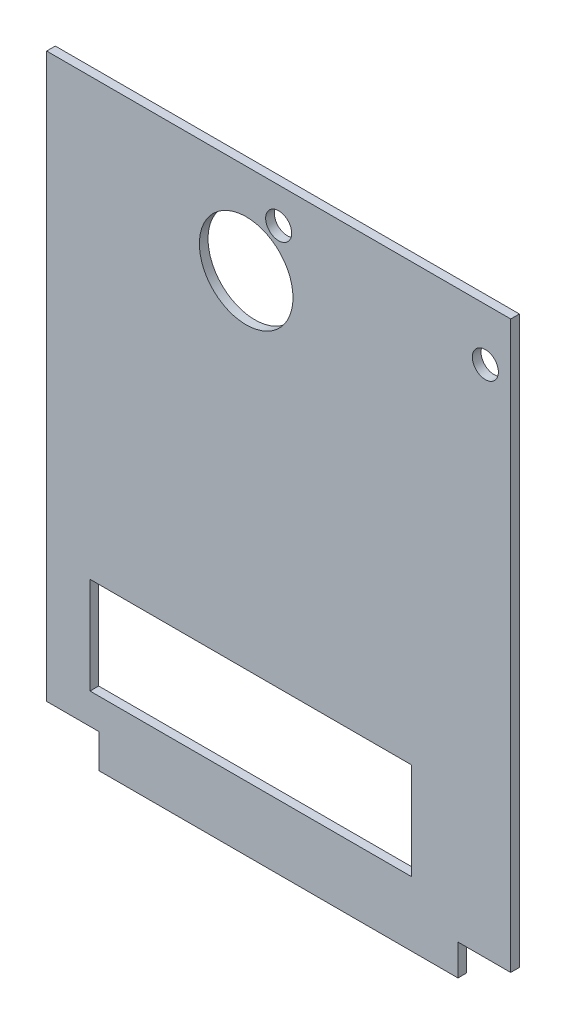
ISO-10303-21;
HEADER;
FILE_DESCRIPTION(('STEP AP214'),'2;1');
FILE_NAME('part.step','',(''),(''),'','','');
FILE_SCHEMA(('AUTOMOTIVE_DESIGN { 1 0 10303 214 1 1 1 1 }'));
ENDSEC;
DATA;
#1=APPLICATION_CONTEXT('core data for automotive mechanical design processes');
#2=APPLICATION_PROTOCOL_DEFINITION('international standard','automotive_design',2000,#1);
#3=PRODUCT_CONTEXT('',#1,'mechanical');
#4=PRODUCT('Part','Part','',(#3));
#5=PRODUCT_RELATED_PRODUCT_CATEGORY('part','',(#4));
#6=PRODUCT_DEFINITION_FORMATION('','',#4);
#7=PRODUCT_DEFINITION_CONTEXT('part definition',#1,'design');
#8=PRODUCT_DEFINITION('design','',#6,#7);
#9=PRODUCT_DEFINITION_SHAPE('','',#8);
#10=(LENGTH_UNIT() NAMED_UNIT(*) SI_UNIT(.MILLI.,.METRE.));
#11=(NAMED_UNIT(*) PLANE_ANGLE_UNIT() SI_UNIT($,.RADIAN.));
#12=(NAMED_UNIT(*) SI_UNIT($,.STERADIAN.) SOLID_ANGLE_UNIT());
#13=UNCERTAINTY_MEASURE_WITH_UNIT(LENGTH_MEASURE(1.E-05),#10,'distance_accuracy_value','');
#14=(GEOMETRIC_REPRESENTATION_CONTEXT(3) GLOBAL_UNCERTAINTY_ASSIGNED_CONTEXT((#13)) GLOBAL_UNIT_ASSIGNED_CONTEXT((#10,
#11,#12)) REPRESENTATION_CONTEXT('',''));
#15=CARTESIAN_POINT('',(0.,0.,0.));
#16=DIRECTION('',(0.,0.,1.));
#17=DIRECTION('',(1.,0.,0.));
#18=AXIS2_PLACEMENT_3D('',#15,#16,#17);
#19=CARTESIAN_POINT('',(-42.8139737991267,46.3633187772926,1.524));
#20=DIRECTION('',(1.,0.,0.));
#21=DIRECTION('',(0.,1.,0.));
#22=AXIS2_PLACEMENT_3D('',#19,#20,#21);
#23=PLANE('',#22);
#24=DIRECTION('',(0.,-1.,0.));
#25=VECTOR('',#24,1.);
#26=CARTESIAN_POINT('',(-42.8139737991267,46.3633187772926,0.));
#27=LINE('',#26,#25);
#28=CARTESIAN_POINT('',(-42.8139737991267,46.3633187772926,0.));
#29=VERTEX_POINT('',#28);
#30=CARTESIAN_POINT('',(-42.8139737991266,-52.5886812227074,0.));
#31=VERTEX_POINT('',#30);
#32=EDGE_CURVE('E197',#29,#31,#27,.T.);
#33=ORIENTED_EDGE('',*,*,#32,.T.);
#34=DIRECTION('',(0.,0.,1.));
#35=VECTOR('',#34,1.);
#36=CARTESIAN_POINT('',(-42.8139737991266,-52.5886812227074,0.));
#37=LINE('',#36,#35);
#38=CARTESIAN_POINT('',(-42.8139737991266,-52.5886812227074,1.524));
#39=VERTEX_POINT('',#38);
#40=EDGE_CURVE('E194',#31,#39,#37,.T.);
#41=ORIENTED_EDGE('',*,*,#40,.T.);
#42=DIRECTION('',(0.,-1.,0.));
#43=VECTOR('',#42,1.);
#44=CARTESIAN_POINT('',(-42.8139737991267,46.3633187772926,1.524));
#45=LINE('',#44,#43);
#46=CARTESIAN_POINT('',(-42.8139737991267,46.3633187772926,1.524));
#47=VERTEX_POINT('',#46);
#48=EDGE_CURVE('E201',#47,#39,#45,.T.);
#49=ORIENTED_EDGE('',*,*,#48,.F.);
#50=DIRECTION('',(0.,0.,-1.));
#51=VECTOR('',#50,1.);
#52=CARTESIAN_POINT('',(-42.8139737991267,46.3633187772926,1.524));
#53=LINE('',#52,#51);
#54=EDGE_CURVE('E43',#47,#29,#53,.T.);
#55=ORIENTED_EDGE('',*,*,#54,.T.);
#56=EDGE_LOOP('',(#33,#41,#49,#55));
#57=FACE_BOUND('',#56,.T.);
#58=ADVANCED_FACE('F35',(#57),#23,.F.);
#59=CARTESIAN_POINT('',(-42.8139737991266,-58.5386812227074,1.524));
#60=DIRECTION('',(0.,1.,0.));
#61=DIRECTION('',(0.,0.,1.));
#62=AXIS2_PLACEMENT_3D('',#59,#60,#61);
#63=PLANE('',#62);
#64=DIRECTION('',(1.,0.,0.));
#65=VECTOR('',#64,1.);
#66=CARTESIAN_POINT('',(-42.8139737991266,-58.5386812227074,0.));
#67=LINE('',#66,#65);
#68=CARTESIAN_POINT('',(-33.6439737991266,-58.5386812227074,0.));
#69=VERTEX_POINT('',#68);
#70=CARTESIAN_POINT('',(29.4539364337291,-58.5386812227074,0.));
#71=VERTEX_POINT('',#70);
#72=EDGE_CURVE('E214',#69,#71,#67,.T.);
#73=ORIENTED_EDGE('',*,*,#72,.T.);
#74=DIRECTION('',(0.,0.,1.));
#75=VECTOR('',#74,1.);
#76=CARTESIAN_POINT('',(29.4539364337291,-58.5386812227074,0.));
#77=LINE('',#76,#75);
#78=CARTESIAN_POINT('',(29.4539364337291,-58.5386812227074,1.524));
#79=VERTEX_POINT('',#78);
#80=EDGE_CURVE('E176',#71,#79,#77,.T.);
#81=ORIENTED_EDGE('',*,*,#80,.T.);
#82=DIRECTION('',(1.,0.,0.));
#83=VECTOR('',#82,1.);
#84=CARTESIAN_POINT('',(-42.8139737991266,-58.5386812227074,1.524));
#85=LINE('',#84,#83);
#86=CARTESIAN_POINT('',(-33.6439737991266,-58.5386812227074,1.524));
#87=VERTEX_POINT('',#86);
#88=EDGE_CURVE('E204',#87,#79,#85,.T.);
#89=ORIENTED_EDGE('',*,*,#88,.F.);
#90=DIRECTION('',(0.,0.,1.));
#91=VECTOR('',#90,1.);
#92=CARTESIAN_POINT('',(-33.6439737991266,-58.5386812227074,0.));
#93=LINE('',#92,#91);
#94=EDGE_CURVE('E190',#69,#87,#93,.T.);
#95=ORIENTED_EDGE('',*,*,#94,.F.);
#96=EDGE_LOOP('',(#73,#81,#89,#95));
#97=FACE_BOUND('',#96,.T.);
#98=ADVANCED_FACE('F255',(#97),#63,.F.);
#99=CARTESIAN_POINT('',(38.7200262008733,46.3633187772926,1.524));
#100=DIRECTION('',(-1.,0.,0.));
#101=DIRECTION('',(0.,-1.,0.));
#102=AXIS2_PLACEMENT_3D('',#99,#100,#101);
#103=PLANE('',#102);
#104=DIRECTION('',(0.,1.,0.));
#105=VECTOR('',#104,1.);
#106=CARTESIAN_POINT('',(38.7200262008733,46.3633187772926,1.524));
#107=LINE('',#106,#105);
#108=CARTESIAN_POINT('',(38.7200262008734,-53.0666812227074,1.524));
#109=VERTEX_POINT('',#108);
#110=CARTESIAN_POINT('',(38.7200262008733,46.3633187772926,1.524));
#111=VERTEX_POINT('',#110);
#112=EDGE_CURVE('E208',#109,#111,#107,.T.);
#113=ORIENTED_EDGE('',*,*,#112,.F.);
#114=DIRECTION('',(0.,0.,1.));
#115=VECTOR('',#114,1.);
#116=CARTESIAN_POINT('',(38.7200262008734,-53.0666812227074,0.));
#117=LINE('',#116,#115);
#118=CARTESIAN_POINT('',(38.7200262008734,-53.0666812227074,0.));
#119=VERTEX_POINT('',#118);
#120=EDGE_CURVE('E172',#119,#109,#117,.T.);
#121=ORIENTED_EDGE('',*,*,#120,.F.);
#122=DIRECTION('',(0.,1.,0.));
#123=VECTOR('',#122,1.);
#124=CARTESIAN_POINT('',(38.7200262008733,46.3633187772926,0.));
#125=LINE('',#124,#123);
#126=CARTESIAN_POINT('',(38.7200262008733,46.3633187772926,0.));
#127=VERTEX_POINT('',#126);
#128=EDGE_CURVE('E217',#119,#127,#125,.T.);
#129=ORIENTED_EDGE('',*,*,#128,.T.);
#130=DIRECTION('',(0.,0.,-1.));
#131=VECTOR('',#130,1.);
#132=CARTESIAN_POINT('',(38.7200262008733,46.3633187772926,1.524));
#133=LINE('',#132,#131);
#134=EDGE_CURVE('E11',#111,#127,#133,.T.);
#135=ORIENTED_EDGE('',*,*,#134,.F.);
#136=EDGE_LOOP('',(#113,#121,#129,#135));
#137=FACE_BOUND('',#136,.T.);
#138=ADVANCED_FACE('F247',(#137),#103,.F.);
#139=CARTESIAN_POINT('',(-42.8139737991267,46.3633187772926,1.524));
#140=DIRECTION('',(0.,-1.,0.));
#141=DIRECTION('',(0.,0.,-1.));
#142=AXIS2_PLACEMENT_3D('',#139,#140,#141);
#143=PLANE('',#142);
#144=DIRECTION('',(-1.,0.,0.));
#145=VECTOR('',#144,1.);
#146=CARTESIAN_POINT('',(-42.8139737991267,46.3633187772926,0.));
#147=LINE('',#146,#145);
#148=EDGE_CURVE('E205',#127,#29,#147,.T.);
#149=ORIENTED_EDGE('',*,*,#148,.T.);
#150=ORIENTED_EDGE('',*,*,#54,.F.);
#151=DIRECTION('',(-1.,0.,0.));
#152=VECTOR('',#151,1.);
#153=CARTESIAN_POINT('',(-42.8139737991267,46.3633187772926,1.524));
#154=LINE('',#153,#152);
#155=EDGE_CURVE('E210',#111,#47,#154,.T.);
#156=ORIENTED_EDGE('',*,*,#155,.F.);
#157=ORIENTED_EDGE('',*,*,#134,.T.);
#158=EDGE_LOOP('',(#149,#150,#156,#157));
#159=FACE_BOUND('',#158,.T.);
#160=ADVANCED_FACE('F245',(#159),#143,.F.);
#161=CARTESIAN_POINT('',(0.,0.,1.524));
#162=DIRECTION('',(0.,0.,1.));
#163=DIRECTION('',(1.,0.,0.));
#164=AXIS2_PLACEMENT_3D('',#161,#162,#163);
#165=PLANE('',#164);
#166=CARTESIAN_POINT('',(-7.75309894264389,30.4572449747181,1.524));
#167=DIRECTION('',(0.,0.,1.));
#168=DIRECTION('',(1.,0.,0.));
#169=AXIS2_PLACEMENT_3D('',#166,#167,#168);
#170=CIRCLE('',#169,8.22407723947342);
#171=CARTESIAN_POINT('',(0.470978296829531,30.4572449747181,1.524));
#172=VERTEX_POINT('',#171);
#173=EDGE_CURVE('E306',#172,#172,#170,.T.);
#174=ORIENTED_EDGE('',*,*,#173,.F.);
#175=EDGE_LOOP('',(#174));
#176=FACE_BOUND('',#175,.T.);
#177=CARTESIAN_POINT('',(34.2650262008734,37.1933187772926,1.524));
#178=DIRECTION('',(0.,0.,1.));
#179=DIRECTION('',(1.,0.,0.));
#180=AXIS2_PLACEMENT_3D('',#177,#178,#179);
#181=CIRCLE('',#180,2.285);
#182=CARTESIAN_POINT('',(36.5500262008734,37.1933187772926,1.524));
#183=VERTEX_POINT('',#182);
#184=EDGE_CURVE('E309',#183,#183,#181,.T.);
#185=ORIENTED_EDGE('',*,*,#184,.F.);
#186=EDGE_LOOP('',(#185));
#187=FACE_BOUND('',#186,.T.);
#188=CARTESIAN_POINT('',(-2.04697379912665,40.1583187772926,1.524));
#189=DIRECTION('',(0.,0.,1.));
#190=DIRECTION('',(1.,0.,0.));
#191=AXIS2_PLACEMENT_3D('',#188,#189,#190);
#192=CIRCLE('',#191,2.285);
#193=CARTESIAN_POINT('',(0.238026200873347,40.1583187772926,1.524));
#194=VERTEX_POINT('',#193);
#195=EDGE_CURVE('E148',#194,#194,#192,.T.);
#196=ORIENTED_EDGE('',*,*,#195,.F.);
#197=EDGE_LOOP('',(#196));
#198=FACE_BOUND('',#197,.T.);
#199=DIRECTION('',(0.,1.,0.));
#200=VECTOR('',#199,1.);
#201=CARTESIAN_POINT('',(21.3160262008734,-47.1986812227074,1.524));
#202=LINE('',#201,#200);
#203=CARTESIAN_POINT('',(21.3160262008734,-47.1986812227074,1.524));
#204=VERTEX_POINT('',#203);
#205=CARTESIAN_POINT('',(21.3160262008734,-30.1986812227074,1.524));
#206=VERTEX_POINT('',#205);
#207=EDGE_CURVE('E50',#204,#206,#202,.T.);
#208=ORIENTED_EDGE('',*,*,#207,.F.);
#209=DIRECTION('',(1.,0.,0.));
#210=VECTOR('',#209,1.);
#211=CARTESIAN_POINT('',(-35.1839737991266,-47.1986812227074,1.524));
#212=LINE('',#211,#210);
#213=CARTESIAN_POINT('',(-35.1839737991266,-47.1986812227074,1.524));
#214=VERTEX_POINT('',#213);
#215=EDGE_CURVE('E142',#214,#204,#212,.T.);
#216=ORIENTED_EDGE('',*,*,#215,.F.);
#217=DIRECTION('',(0.,-1.,0.));
#218=VECTOR('',#217,1.);
#219=CARTESIAN_POINT('',(-35.1839737991266,-47.1986812227074,1.524));
#220=LINE('',#219,#218);
#221=CARTESIAN_POINT('',(-35.1839737991266,-30.1986812227074,1.524));
#222=VERTEX_POINT('',#221);
#223=EDGE_CURVE('E145',#222,#214,#220,.T.);
#224=ORIENTED_EDGE('',*,*,#223,.F.);
#225=DIRECTION('',(-1.,0.,0.));
#226=VECTOR('',#225,1.);
#227=CARTESIAN_POINT('',(-35.1839737991266,-30.1986812227074,1.524));
#228=LINE('',#227,#226);
#229=EDGE_CURVE('E154',#206,#222,#228,.T.);
#230=ORIENTED_EDGE('',*,*,#229,.F.);
#231=EDGE_LOOP('',(#208,#216,#224,#230));
#232=FACE_BOUND('',#231,.T.);
#233=DIRECTION('',(0.,-1.,0.));
#234=VECTOR('',#233,1.);
#235=CARTESIAN_POINT('',(29.4539364337291,-58.5386812227074,1.524));
#236=LINE('',#235,#234);
#237=CARTESIAN_POINT('',(29.4539364337291,-53.0666812227074,1.524));
#238=VERTEX_POINT('',#237);
#239=EDGE_CURVE('E169',#238,#79,#236,.T.);
#240=ORIENTED_EDGE('',*,*,#239,.F.);
#241=DIRECTION('',(-1.,0.,0.));
#242=VECTOR('',#241,1.);
#243=CARTESIAN_POINT('',(38.7200262008734,-53.0666812227074,1.524));
#244=LINE('',#243,#242);
#245=EDGE_CURVE('E161',#109,#238,#244,.T.);
#246=ORIENTED_EDGE('',*,*,#245,.F.);
#247=ORIENTED_EDGE('',*,*,#112,.T.);
#248=ORIENTED_EDGE('',*,*,#155,.T.);
#249=ORIENTED_EDGE('',*,*,#48,.T.);
#250=DIRECTION('',(-1.,0.,0.));
#251=VECTOR('',#250,1.);
#252=CARTESIAN_POINT('',(-42.8139737991266,-52.5886812227074,1.524));
#253=LINE('',#252,#251);
#254=CARTESIAN_POINT('',(-33.6439737991266,-52.5886812227074,1.524));
#255=VERTEX_POINT('',#254);
#256=EDGE_CURVE('E187',#255,#39,#253,.T.);
#257=ORIENTED_EDGE('',*,*,#256,.F.);
#258=DIRECTION('',(0.,1.,0.));
#259=VECTOR('',#258,1.);
#260=CARTESIAN_POINT('',(-33.6439737991266,-58.5386812227074,1.524));
#261=LINE('',#260,#259);
#262=EDGE_CURVE('E179',#87,#255,#261,.T.);
#263=ORIENTED_EDGE('',*,*,#262,.F.);
#264=ORIENTED_EDGE('',*,*,#88,.T.);
#265=EDGE_LOOP('',(#240,#246,#247,#248,#249,#257,#263,#264));
#266=FACE_BOUND('',#265,.T.);
#267=ADVANCED_FACE('F241',(#176,#187,#198,#232,#266),#165,.T.);
#268=CARTESIAN_POINT('',(0.,0.,0.));
#269=DIRECTION('',(0.,0.,1.));
#270=DIRECTION('',(1.,0.,0.));
#271=AXIS2_PLACEMENT_3D('',#268,#269,#270);
#272=PLANE('',#271);
#273=CARTESIAN_POINT('',(-7.75309894264389,30.4572449747181,0.));
#274=DIRECTION('',(0.,0.,1.));
#275=DIRECTION('',(1.,0.,0.));
#276=AXIS2_PLACEMENT_3D('',#273,#274,#275);
#277=CIRCLE('',#276,8.22407723947342);
#278=CARTESIAN_POINT('',(0.470978296829531,30.4572449747181,0.));
#279=VERTEX_POINT('',#278);
#280=EDGE_CURVE('E38',#279,#279,#277,.T.);
#281=ORIENTED_EDGE('',*,*,#280,.T.);
#282=EDGE_LOOP('',(#281));
#283=FACE_BOUND('',#282,.T.);
#284=CARTESIAN_POINT('',(34.2650262008734,37.1933187772926,0.));
#285=DIRECTION('',(0.,0.,1.));
#286=DIRECTION('',(1.,0.,0.));
#287=AXIS2_PLACEMENT_3D('',#284,#285,#286);
#288=CIRCLE('',#287,2.285);
#289=CARTESIAN_POINT('',(36.5500262008734,37.1933187772926,0.));
#290=VERTEX_POINT('',#289);
#291=EDGE_CURVE('E311',#290,#290,#288,.T.);
#292=ORIENTED_EDGE('',*,*,#291,.T.);
#293=EDGE_LOOP('',(#292));
#294=FACE_BOUND('',#293,.T.);
#295=CARTESIAN_POINT('',(-2.04697379912665,40.1583187772926,0.));
#296=DIRECTION('',(0.,0.,1.));
#297=DIRECTION('',(1.,0.,0.));
#298=AXIS2_PLACEMENT_3D('',#295,#296,#297);
#299=CIRCLE('',#298,2.285);
#300=CARTESIAN_POINT('',(0.238026200873347,40.1583187772926,0.));
#301=VERTEX_POINT('',#300);
#302=EDGE_CURVE('E155',#301,#301,#299,.T.);
#303=ORIENTED_EDGE('',*,*,#302,.T.);
#304=EDGE_LOOP('',(#303));
#305=FACE_BOUND('',#304,.T.);
#306=DIRECTION('',(1.,0.,0.));
#307=VECTOR('',#306,1.);
#308=CARTESIAN_POINT('',(-35.1839737991266,-47.1986812227074,0.));
#309=LINE('',#308,#307);
#310=CARTESIAN_POINT('',(-35.1839737991266,-47.1986812227074,0.));
#311=VERTEX_POINT('',#310);
#312=CARTESIAN_POINT('',(21.3160262008734,-47.1986812227074,0.));
#313=VERTEX_POINT('',#312);
#314=EDGE_CURVE('E132',#311,#313,#309,.T.);
#315=ORIENTED_EDGE('',*,*,#314,.T.);
#316=DIRECTION('',(0.,1.,0.));
#317=VECTOR('',#316,1.);
#318=CARTESIAN_POINT('',(21.3160262008734,-47.1986812227074,0.));
#319=LINE('',#318,#317);
#320=CARTESIAN_POINT('',(21.3160262008734,-30.1986812227074,0.));
#321=VERTEX_POINT('',#320);
#322=EDGE_CURVE('E126',#313,#321,#319,.T.);
#323=ORIENTED_EDGE('',*,*,#322,.T.);
#324=DIRECTION('',(-1.,0.,0.));
#325=VECTOR('',#324,1.);
#326=CARTESIAN_POINT('',(-35.1839737991266,-30.1986812227074,0.));
#327=LINE('',#326,#325);
#328=CARTESIAN_POINT('',(-35.1839737991266,-30.1986812227074,0.));
#329=VERTEX_POINT('',#328);
#330=EDGE_CURVE('E135',#321,#329,#327,.T.);
#331=ORIENTED_EDGE('',*,*,#330,.T.);
#332=DIRECTION('',(0.,-1.,0.));
#333=VECTOR('',#332,1.);
#334=CARTESIAN_POINT('',(-35.1839737991266,-47.1986812227074,0.));
#335=LINE('',#334,#333);
#336=EDGE_CURVE('E58',#329,#311,#335,.T.);
#337=ORIENTED_EDGE('',*,*,#336,.T.);
#338=EDGE_LOOP('',(#315,#323,#331,#337));
#339=FACE_BOUND('',#338,.T.);
#340=DIRECTION('',(-1.,0.,0.));
#341=VECTOR('',#340,1.);
#342=CARTESIAN_POINT('',(38.7200262008734,-53.0666812227074,0.));
#343=LINE('',#342,#341);
#344=CARTESIAN_POINT('',(29.4539364337291,-53.0666812227074,0.));
#345=VERTEX_POINT('',#344);
#346=EDGE_CURVE('E165',#119,#345,#343,.T.);
#347=ORIENTED_EDGE('',*,*,#346,.T.);
#348=DIRECTION('',(0.,-1.,0.));
#349=VECTOR('',#348,1.);
#350=CARTESIAN_POINT('',(29.4539364337291,-58.5386812227074,0.));
#351=LINE('',#350,#349);
#352=EDGE_CURVE('E168',#345,#71,#351,.T.);
#353=ORIENTED_EDGE('',*,*,#352,.T.);
#354=ORIENTED_EDGE('',*,*,#72,.F.);
#355=DIRECTION('',(0.,1.,0.));
#356=VECTOR('',#355,1.);
#357=CARTESIAN_POINT('',(-33.6439737991266,-58.5386812227074,0.));
#358=LINE('',#357,#356);
#359=CARTESIAN_POINT('',(-33.6439737991266,-52.5886812227074,0.));
#360=VERTEX_POINT('',#359);
#361=EDGE_CURVE('E183',#69,#360,#358,.T.);
#362=ORIENTED_EDGE('',*,*,#361,.T.);
#363=DIRECTION('',(-1.,0.,0.));
#364=VECTOR('',#363,1.);
#365=CARTESIAN_POINT('',(-42.8139737991266,-52.5886812227074,0.));
#366=LINE('',#365,#364);
#367=EDGE_CURVE('E186',#360,#31,#366,.T.);
#368=ORIENTED_EDGE('',*,*,#367,.T.);
#369=ORIENTED_EDGE('',*,*,#32,.F.);
#370=ORIENTED_EDGE('',*,*,#148,.F.);
#371=ORIENTED_EDGE('',*,*,#128,.F.);
#372=EDGE_LOOP('',(#347,#353,#354,#362,#368,#369,#370,#371));
#373=FACE_BOUND('',#372,.T.);
#374=ADVANCED_FACE('F139',(#283,#294,#305,#339,#373),#272,.F.);
#375=CARTESIAN_POINT('',(-42.8139737991266,-52.5886812227074,0.));
#376=DIRECTION('',(0.,1.,0.));
#377=DIRECTION('',(0.,0.,1.));
#378=AXIS2_PLACEMENT_3D('',#375,#376,#377);
#379=PLANE('',#378);
#380=ORIENTED_EDGE('',*,*,#256,.T.);
#381=ORIENTED_EDGE('',*,*,#40,.F.);
#382=ORIENTED_EDGE('',*,*,#367,.F.);
#383=DIRECTION('',(0.,0.,1.));
#384=VECTOR('',#383,1.);
#385=CARTESIAN_POINT('',(-33.6439737991266,-52.5886812227074,0.));
#386=LINE('',#385,#384);
#387=EDGE_CURVE('E198',#360,#255,#386,.T.);
#388=ORIENTED_EDGE('',*,*,#387,.T.);
#389=EDGE_LOOP('',(#380,#381,#382,#388));
#390=FACE_BOUND('',#389,.T.);
#391=ADVANCED_FACE('F232',(#390),#379,.F.);
#392=CARTESIAN_POINT('',(-33.6439737991266,-58.5386812227074,0.));
#393=DIRECTION('',(1.,0.,0.));
#394=DIRECTION('',(0.,0.,-1.));
#395=AXIS2_PLACEMENT_3D('',#392,#393,#394);
#396=PLANE('',#395);
#397=ORIENTED_EDGE('',*,*,#262,.T.);
#398=ORIENTED_EDGE('',*,*,#387,.F.);
#399=ORIENTED_EDGE('',*,*,#361,.F.);
#400=ORIENTED_EDGE('',*,*,#94,.T.);
#401=EDGE_LOOP('',(#397,#398,#399,#400));
#402=FACE_BOUND('',#401,.T.);
#403=ADVANCED_FACE('F234',(#402),#396,.F.);
#404=CARTESIAN_POINT('',(29.4539364337291,-58.5386812227074,0.));
#405=DIRECTION('',(-1.,0.,0.));
#406=DIRECTION('',(0.,0.,1.));
#407=AXIS2_PLACEMENT_3D('',#404,#405,#406);
#408=PLANE('',#407);
#409=ORIENTED_EDGE('',*,*,#239,.T.);
#410=ORIENTED_EDGE('',*,*,#80,.F.);
#411=ORIENTED_EDGE('',*,*,#352,.F.);
#412=DIRECTION('',(0.,0.,1.));
#413=VECTOR('',#412,1.);
#414=CARTESIAN_POINT('',(29.4539364337291,-53.0666812227074,0.));
#415=LINE('',#414,#413);
#416=EDGE_CURVE('E180',#345,#238,#415,.T.);
#417=ORIENTED_EDGE('',*,*,#416,.T.);
#418=EDGE_LOOP('',(#409,#410,#411,#417));
#419=FACE_BOUND('',#418,.T.);
#420=ADVANCED_FACE('F253',(#419),#408,.F.);
#421=CARTESIAN_POINT('',(38.7200262008734,-53.0666812227074,0.));
#422=DIRECTION('',(0.,1.,0.));
#423=DIRECTION('',(0.,0.,1.));
#424=AXIS2_PLACEMENT_3D('',#421,#422,#423);
#425=PLANE('',#424);
#426=ORIENTED_EDGE('',*,*,#245,.T.);
#427=ORIENTED_EDGE('',*,*,#416,.F.);
#428=ORIENTED_EDGE('',*,*,#346,.F.);
#429=ORIENTED_EDGE('',*,*,#120,.T.);
#430=EDGE_LOOP('',(#426,#427,#428,#429));
#431=FACE_BOUND('',#430,.T.);
#432=ADVANCED_FACE('F251',(#431),#425,.F.);
#433=CARTESIAN_POINT('',(21.3160262008734,-47.1986812227074,0.));
#434=DIRECTION('',(1.,0.,0.));
#435=DIRECTION('',(0.,0.,-1.));
#436=AXIS2_PLACEMENT_3D('',#433,#434,#435);
#437=PLANE('',#436);
#438=ORIENTED_EDGE('',*,*,#207,.T.);
#439=DIRECTION('',(0.,0.,1.));
#440=VECTOR('',#439,1.);
#441=CARTESIAN_POINT('',(21.3160262008734,-30.1986812227074,0.));
#442=LINE('',#441,#440);
#443=EDGE_CURVE('E122',#321,#206,#442,.T.);
#444=ORIENTED_EDGE('',*,*,#443,.F.);
#445=ORIENTED_EDGE('',*,*,#322,.F.);
#446=DIRECTION('',(0.,0.,1.));
#447=VECTOR('',#446,1.);
#448=CARTESIAN_POINT('',(21.3160262008734,-47.1986812227074,0.));
#449=LINE('',#448,#447);
#450=EDGE_CURVE('E159',#313,#204,#449,.T.);
#451=ORIENTED_EDGE('',*,*,#450,.T.);
#452=EDGE_LOOP('',(#438,#444,#445,#451));
#453=FACE_BOUND('',#452,.T.);
#454=ADVANCED_FACE('F124',(#453),#437,.F.);
#455=CARTESIAN_POINT('',(-35.1839737991266,-47.1986812227074,0.));
#456=DIRECTION('',(0.,-1.,0.));
#457=DIRECTION('',(0.,0.,-1.));
#458=AXIS2_PLACEMENT_3D('',#455,#456,#457);
#459=PLANE('',#458);
#460=ORIENTED_EDGE('',*,*,#215,.T.);
#461=ORIENTED_EDGE('',*,*,#450,.F.);
#462=ORIENTED_EDGE('',*,*,#314,.F.);
#463=DIRECTION('',(0.,0.,1.));
#464=VECTOR('',#463,1.);
#465=CARTESIAN_POINT('',(-35.1839737991266,-47.1986812227074,0.));
#466=LINE('',#465,#464);
#467=EDGE_CURVE('E162',#311,#214,#466,.T.);
#468=ORIENTED_EDGE('',*,*,#467,.T.);
#469=EDGE_LOOP('',(#460,#461,#462,#468));
#470=FACE_BOUND('',#469,.T.);
#471=ADVANCED_FACE('F281',(#470),#459,.F.);
#472=CARTESIAN_POINT('',(-35.1839737991266,-47.1986812227074,0.));
#473=DIRECTION('',(-1.,0.,0.));
#474=DIRECTION('',(0.,0.,1.));
#475=AXIS2_PLACEMENT_3D('',#472,#473,#474);
#476=PLANE('',#475);
#477=ORIENTED_EDGE('',*,*,#223,.T.);
#478=ORIENTED_EDGE('',*,*,#467,.F.);
#479=ORIENTED_EDGE('',*,*,#336,.F.);
#480=DIRECTION('',(0.,0.,1.));
#481=VECTOR('',#480,1.);
#482=CARTESIAN_POINT('',(-35.1839737991266,-30.1986812227074,0.));
#483=LINE('',#482,#481);
#484=EDGE_CURVE('E131',#329,#222,#483,.T.);
#485=ORIENTED_EDGE('',*,*,#484,.T.);
#486=EDGE_LOOP('',(#477,#478,#479,#485));
#487=FACE_BOUND('',#486,.T.);
#488=ADVANCED_FACE('F285',(#487),#476,.F.);
#489=CARTESIAN_POINT('',(-35.1839737991266,-30.1986812227074,0.));
#490=DIRECTION('',(0.,1.,0.));
#491=DIRECTION('',(0.,0.,1.));
#492=AXIS2_PLACEMENT_3D('',#489,#490,#491);
#493=PLANE('',#492);
#494=ORIENTED_EDGE('',*,*,#229,.T.);
#495=ORIENTED_EDGE('',*,*,#484,.F.);
#496=ORIENTED_EDGE('',*,*,#330,.F.);
#497=ORIENTED_EDGE('',*,*,#443,.T.);
#498=EDGE_LOOP('',(#494,#495,#496,#497));
#499=FACE_BOUND('',#498,.T.);
#500=ADVANCED_FACE('F136',(#499),#493,.F.);
#501=CARTESIAN_POINT('',(-2.04697379912665,40.1583187772926,0.));
#502=DIRECTION('',(0.,0.,1.));
#503=DIRECTION('',(1.,0.,0.));
#504=AXIS2_PLACEMENT_3D('',#501,#502,#503);
#505=CYLINDRICAL_SURFACE('',#504,2.285);
#506=CARTESIAN_POINT('',(0.238026200873347,40.1583187772926,0.));
#507=CARTESIAN_POINT('',(0.238026200873347,40.1583187772926,0.015875));
#508=CARTESIAN_POINT('',(0.238026200873347,40.1583187772926,0.03175));
#509=CARTESIAN_POINT('',(0.238026200873347,40.1583187772926,0.0635));
#510=CARTESIAN_POINT('',(0.238026200873347,40.1583187772926,0.079375));
#511=CARTESIAN_POINT('',(0.238026200873347,40.1583187772926,0.111125));
#512=CARTESIAN_POINT('',(0.238026200873347,40.1583187772926,0.127));
#513=CARTESIAN_POINT('',(0.238026200873347,40.1583187772926,0.15875));
#514=CARTESIAN_POINT('',(0.238026200873347,40.1583187772926,0.174625));
#515=CARTESIAN_POINT('',(0.238026200873347,40.1583187772926,0.206375));
#516=CARTESIAN_POINT('',(0.238026200873347,40.1583187772926,0.22225));
#517=CARTESIAN_POINT('',(0.238026200873347,40.1583187772926,0.254));
#518=CARTESIAN_POINT('',(0.238026200873347,40.1583187772926,0.269875));
#519=CARTESIAN_POINT('',(0.238026200873347,40.1583187772926,0.301625));
#520=CARTESIAN_POINT('',(0.238026200873347,40.1583187772926,0.3175));
#521=CARTESIAN_POINT('',(0.238026200873347,40.1583187772926,0.34925));
#522=CARTESIAN_POINT('',(0.238026200873347,40.1583187772926,0.365125));
#523=CARTESIAN_POINT('',(0.238026200873347,40.1583187772926,0.396875));
#524=CARTESIAN_POINT('',(0.238026200873347,40.1583187772926,0.41275));
#525=CARTESIAN_POINT('',(0.238026200873347,40.1583187772926,0.4445));
#526=CARTESIAN_POINT('',(0.238026200873347,40.1583187772926,0.460375));
#527=CARTESIAN_POINT('',(0.238026200873347,40.1583187772926,0.492125));
#528=CARTESIAN_POINT('',(0.238026200873347,40.1583187772926,0.508));
#529=CARTESIAN_POINT('',(0.238026200873347,40.1583187772926,0.53975));
#530=CARTESIAN_POINT('',(0.238026200873347,40.1583187772926,0.555625));
#531=CARTESIAN_POINT('',(0.238026200873347,40.1583187772926,0.587375));
#532=CARTESIAN_POINT('',(0.238026200873347,40.1583187772926,0.60325));
#533=CARTESIAN_POINT('',(0.238026200873347,40.1583187772926,0.635));
#534=CARTESIAN_POINT('',(0.238026200873347,40.1583187772926,0.650875));
#535=CARTESIAN_POINT('',(0.238026200873347,40.1583187772926,0.682625));
#536=CARTESIAN_POINT('',(0.238026200873347,40.1583187772926,0.6985));
#537=CARTESIAN_POINT('',(0.238026200873347,40.1583187772926,0.73025));
#538=CARTESIAN_POINT('',(0.238026200873347,40.1583187772926,0.746125));
#539=CARTESIAN_POINT('',(0.238026200873347,40.1583187772926,0.777875));
#540=CARTESIAN_POINT('',(0.238026200873347,40.1583187772926,0.79375));
#541=CARTESIAN_POINT('',(0.238026200873347,40.1583187772926,0.8255));
#542=CARTESIAN_POINT('',(0.238026200873347,40.1583187772926,0.841375));
#543=CARTESIAN_POINT('',(0.238026200873347,40.1583187772926,0.873125));
#544=CARTESIAN_POINT('',(0.238026200873347,40.1583187772926,0.889));
#545=CARTESIAN_POINT('',(0.238026200873347,40.1583187772926,0.92075));
#546=CARTESIAN_POINT('',(0.238026200873347,40.1583187772926,0.936625));
#547=CARTESIAN_POINT('',(0.238026200873347,40.1583187772926,0.968375));
#548=CARTESIAN_POINT('',(0.238026200873347,40.1583187772926,0.98425));
#549=CARTESIAN_POINT('',(0.238026200873347,40.1583187772926,1.016));
#550=CARTESIAN_POINT('',(0.238026200873347,40.1583187772926,1.031875));
#551=CARTESIAN_POINT('',(0.238026200873347,40.1583187772926,1.063625));
#552=CARTESIAN_POINT('',(0.238026200873347,40.1583187772926,1.0795));
#553=CARTESIAN_POINT('',(0.238026200873347,40.1583187772926,1.11125));
#554=CARTESIAN_POINT('',(0.238026200873347,40.1583187772926,1.127125));
#555=CARTESIAN_POINT('',(0.238026200873347,40.1583187772926,1.158875));
#556=CARTESIAN_POINT('',(0.238026200873347,40.1583187772926,1.17475));
#557=CARTESIAN_POINT('',(0.238026200873347,40.1583187772926,1.2065));
#558=CARTESIAN_POINT('',(0.238026200873347,40.1583187772926,1.222375));
#559=CARTESIAN_POINT('',(0.238026200873347,40.1583187772926,1.254125));
#560=CARTESIAN_POINT('',(0.238026200873347,40.1583187772926,1.27));
#561=CARTESIAN_POINT('',(0.238026200873347,40.1583187772926,1.30175));
#562=CARTESIAN_POINT('',(0.238026200873347,40.1583187772926,1.317625));
#563=CARTESIAN_POINT('',(0.238026200873347,40.1583187772926,1.349375));
#564=CARTESIAN_POINT('',(0.238026200873347,40.1583187772926,1.36525));
#565=CARTESIAN_POINT('',(0.238026200873347,40.1583187772926,1.397));
#566=CARTESIAN_POINT('',(0.238026200873347,40.1583187772926,1.412875));
#567=CARTESIAN_POINT('',(0.238026200873347,40.1583187772926,1.444625));
#568=CARTESIAN_POINT('',(0.238026200873347,40.1583187772926,1.4605));
#569=CARTESIAN_POINT('',(0.238026200873347,40.1583187772926,1.49225));
#570=CARTESIAN_POINT('',(0.238026200873347,40.1583187772926,1.508125));
#571=CARTESIAN_POINT('',(0.238026200873347,40.1583187772926,1.524));
#572=B_SPLINE_CURVE_WITH_KNOTS('',3,(#506,#507,#508,#509,#510,#511,#512,#513,#514,#515,#516,
#517,#518,#519,#520,#521,#522,#523,#524,#525,#526,#527,#528,#529,#530,#531,#532,#533,#534,#535,
#536,#537,#538,#539,#540,#541,#542,#543,#544,#545,#546,#547,#548,#549,#550,#551,#552,#553,#554,
#555,#556,#557,#558,#559,#560,#561,#562,#563,#564,#565,#566,#567,#568,#569,#570,#571),
.UNSPECIFIED.,.F.,.F.,(4,2,2,2,2,2,2,2,2,2,2,2,2,2,2,2,2,2,2,2,2,2,2,2,2,2,2,2,2,2,2,2,4),(0.,
0.047625,0.09525,0.142875,0.1905,0.238125,0.28575,0.333375,0.381,0.428625,0.47625,0.523875,
0.5715,0.619125,0.66675,0.714375,0.762,0.809625,0.85725,0.904875,0.9525,1.000125,1.04775,
1.095375,1.143,1.190625,1.23825,1.285875,1.3335,1.381125,1.42875,1.476375,1.524),.UNSPECIFIED.);
#573=EDGE_CURVE('BSEAM284',#301,#194,#572,.T.);
#574=ORIENTED_EDGE('',*,*,#302,.F.);
#575=ORIENTED_EDGE('',*,*,#195,.T.);
#576=ORIENTED_EDGE('',*,*,#573,.T.);
#577=ORIENTED_EDGE('',*,*,#573,.F.);
#578=EDGE_LOOP('',(#574,#576,#575,#577));
#579=FACE_BOUND('',#578,.T.);
#580=ADVANCED_FACE('F284',(#579),#505,.F.);
#581=CARTESIAN_POINT('',(34.2650262008734,37.1933187772926,0.));
#582=DIRECTION('',(0.,0.,1.));
#583=DIRECTION('',(1.,0.,0.));
#584=AXIS2_PLACEMENT_3D('',#581,#582,#583);
#585=CYLINDRICAL_SURFACE('',#584,2.285);
#586=CARTESIAN_POINT('',(36.5500262008734,37.1933187772926,0.));
#587=CARTESIAN_POINT('',(36.5500262008734,37.1933187772926,0.015875));
#588=CARTESIAN_POINT('',(36.5500262008734,37.1933187772926,0.03175));
#589=CARTESIAN_POINT('',(36.5500262008734,37.1933187772926,0.0635));
#590=CARTESIAN_POINT('',(36.5500262008734,37.1933187772926,0.079375));
#591=CARTESIAN_POINT('',(36.5500262008734,37.1933187772926,0.111125));
#592=CARTESIAN_POINT('',(36.5500262008734,37.1933187772926,0.127));
#593=CARTESIAN_POINT('',(36.5500262008734,37.1933187772926,0.15875));
#594=CARTESIAN_POINT('',(36.5500262008734,37.1933187772926,0.174625));
#595=CARTESIAN_POINT('',(36.5500262008734,37.1933187772926,0.206375));
#596=CARTESIAN_POINT('',(36.5500262008734,37.1933187772926,0.22225));
#597=CARTESIAN_POINT('',(36.5500262008734,37.1933187772926,0.254));
#598=CARTESIAN_POINT('',(36.5500262008734,37.1933187772926,0.269875));
#599=CARTESIAN_POINT('',(36.5500262008734,37.1933187772926,0.301625));
#600=CARTESIAN_POINT('',(36.5500262008734,37.1933187772926,0.3175));
#601=CARTESIAN_POINT('',(36.5500262008734,37.1933187772926,0.34925));
#602=CARTESIAN_POINT('',(36.5500262008734,37.1933187772926,0.365125));
#603=CARTESIAN_POINT('',(36.5500262008734,37.1933187772926,0.396875));
#604=CARTESIAN_POINT('',(36.5500262008734,37.1933187772926,0.41275));
#605=CARTESIAN_POINT('',(36.5500262008734,37.1933187772926,0.4445));
#606=CARTESIAN_POINT('',(36.5500262008734,37.1933187772926,0.460375));
#607=CARTESIAN_POINT('',(36.5500262008734,37.1933187772926,0.492125));
#608=CARTESIAN_POINT('',(36.5500262008734,37.1933187772926,0.508));
#609=CARTESIAN_POINT('',(36.5500262008734,37.1933187772926,0.53975));
#610=CARTESIAN_POINT('',(36.5500262008734,37.1933187772926,0.555625));
#611=CARTESIAN_POINT('',(36.5500262008734,37.1933187772926,0.587375));
#612=CARTESIAN_POINT('',(36.5500262008734,37.1933187772926,0.60325));
#613=CARTESIAN_POINT('',(36.5500262008734,37.1933187772926,0.635));
#614=CARTESIAN_POINT('',(36.5500262008734,37.1933187772926,0.650875));
#615=CARTESIAN_POINT('',(36.5500262008734,37.1933187772926,0.682625));
#616=CARTESIAN_POINT('',(36.5500262008734,37.1933187772926,0.6985));
#617=CARTESIAN_POINT('',(36.5500262008734,37.1933187772926,0.73025));
#618=CARTESIAN_POINT('',(36.5500262008734,37.1933187772926,0.746125));
#619=CARTESIAN_POINT('',(36.5500262008734,37.1933187772926,0.777875));
#620=CARTESIAN_POINT('',(36.5500262008734,37.1933187772926,0.79375));
#621=CARTESIAN_POINT('',(36.5500262008734,37.1933187772926,0.8255));
#622=CARTESIAN_POINT('',(36.5500262008734,37.1933187772926,0.841375));
#623=CARTESIAN_POINT('',(36.5500262008734,37.1933187772926,0.873125));
#624=CARTESIAN_POINT('',(36.5500262008734,37.1933187772926,0.889));
#625=CARTESIAN_POINT('',(36.5500262008734,37.1933187772926,0.92075));
#626=CARTESIAN_POINT('',(36.5500262008734,37.1933187772926,0.936625));
#627=CARTESIAN_POINT('',(36.5500262008734,37.1933187772926,0.968375));
#628=CARTESIAN_POINT('',(36.5500262008734,37.1933187772926,0.98425));
#629=CARTESIAN_POINT('',(36.5500262008734,37.1933187772926,1.016));
#630=CARTESIAN_POINT('',(36.5500262008734,37.1933187772926,1.031875));
#631=CARTESIAN_POINT('',(36.5500262008734,37.1933187772926,1.063625));
#632=CARTESIAN_POINT('',(36.5500262008734,37.1933187772926,1.0795));
#633=CARTESIAN_POINT('',(36.5500262008734,37.1933187772926,1.11125));
#634=CARTESIAN_POINT('',(36.5500262008734,37.1933187772926,1.127125));
#635=CARTESIAN_POINT('',(36.5500262008734,37.1933187772926,1.158875));
#636=CARTESIAN_POINT('',(36.5500262008734,37.1933187772926,1.17475));
#637=CARTESIAN_POINT('',(36.5500262008734,37.1933187772926,1.2065));
#638=CARTESIAN_POINT('',(36.5500262008734,37.1933187772926,1.222375));
#639=CARTESIAN_POINT('',(36.5500262008734,37.1933187772926,1.254125));
#640=CARTESIAN_POINT('',(36.5500262008734,37.1933187772926,1.27));
#641=CARTESIAN_POINT('',(36.5500262008734,37.1933187772926,1.30175));
#642=CARTESIAN_POINT('',(36.5500262008734,37.1933187772926,1.317625));
#643=CARTESIAN_POINT('',(36.5500262008734,37.1933187772926,1.349375));
#644=CARTESIAN_POINT('',(36.5500262008734,37.1933187772926,1.36525));
#645=CARTESIAN_POINT('',(36.5500262008734,37.1933187772926,1.397));
#646=CARTESIAN_POINT('',(36.5500262008734,37.1933187772926,1.412875));
#647=CARTESIAN_POINT('',(36.5500262008734,37.1933187772926,1.444625));
#648=CARTESIAN_POINT('',(36.5500262008734,37.1933187772926,1.4605));
#649=CARTESIAN_POINT('',(36.5500262008734,37.1933187772926,1.49225));
#650=CARTESIAN_POINT('',(36.5500262008734,37.1933187772926,1.508125));
#651=CARTESIAN_POINT('',(36.5500262008734,37.1933187772926,1.524));
#652=B_SPLINE_CURVE_WITH_KNOTS('',3,(#586,#587,#588,#589,#590,#591,#592,#593,#594,#595,#596,
#597,#598,#599,#600,#601,#602,#603,#604,#605,#606,#607,#608,#609,#610,#611,#612,#613,#614,#615,
#616,#617,#618,#619,#620,#621,#622,#623,#624,#625,#626,#627,#628,#629,#630,#631,#632,#633,#634,
#635,#636,#637,#638,#639,#640,#641,#642,#643,#644,#645,#646,#647,#648,#649,#650,#651),
.UNSPECIFIED.,.F.,.F.,(4,2,2,2,2,2,2,2,2,2,2,2,2,2,2,2,2,2,2,2,2,2,2,2,2,2,2,2,2,2,2,2,4),(0.,
0.047625,0.09525,0.142875,0.1905,0.238125,0.28575,0.333375,0.381,0.428625,0.47625,0.523875,
0.5715,0.619125,0.66675,0.714375,0.762,0.809625,0.85725,0.904875,0.9525,1.000125,1.04775,
1.095375,1.143,1.190625,1.23825,1.285875,1.3335,1.381125,1.42875,1.476375,1.524),.UNSPECIFIED.);
#653=EDGE_CURVE('BSEAM293',#290,#183,#652,.T.);
#654=ORIENTED_EDGE('',*,*,#291,.F.);
#655=ORIENTED_EDGE('',*,*,#184,.T.);
#656=ORIENTED_EDGE('',*,*,#653,.T.);
#657=ORIENTED_EDGE('',*,*,#653,.F.);
#658=EDGE_LOOP('',(#654,#656,#655,#657));
#659=FACE_BOUND('',#658,.T.);
#660=ADVANCED_FACE('F293',(#659),#585,.F.);
#661=CARTESIAN_POINT('',(-7.75309894264389,30.4572449747181,-1.016));
#662=DIRECTION('',(0.,0.,1.));
#663=DIRECTION('',(1.,0.,0.));
#664=AXIS2_PLACEMENT_3D('',#661,#662,#663);
#665=CYLINDRICAL_SURFACE('',#664,8.22407723947342);
#666=ORIENTED_EDGE('',*,*,#173,.T.);
#667=EDGE_LOOP('',(#666));
#668=FACE_BOUND('',#667,.T.);
#669=ORIENTED_EDGE('',*,*,#280,.F.);
#670=EDGE_LOOP('',(#669));
#671=FACE_BOUND('',#670,.T.);
#672=ADVANCED_FACE('F297',(#668,#671),#665,.F.);
#673=CLOSED_SHELL('',(#58,#98,#138,#160,#267,#374,#391,#403,#420,#432,#454,#471,#488,#500,#580,
#660,#672));
#674=MANIFOLD_SOLID_BREP('B2',#673);
#675=ADVANCED_BREP_SHAPE_REPRESENTATION('',(#18,#674),#14);
#676=SHAPE_DEFINITION_REPRESENTATION(#9,#675);
ENDSEC;
END-ISO-10303-21;
